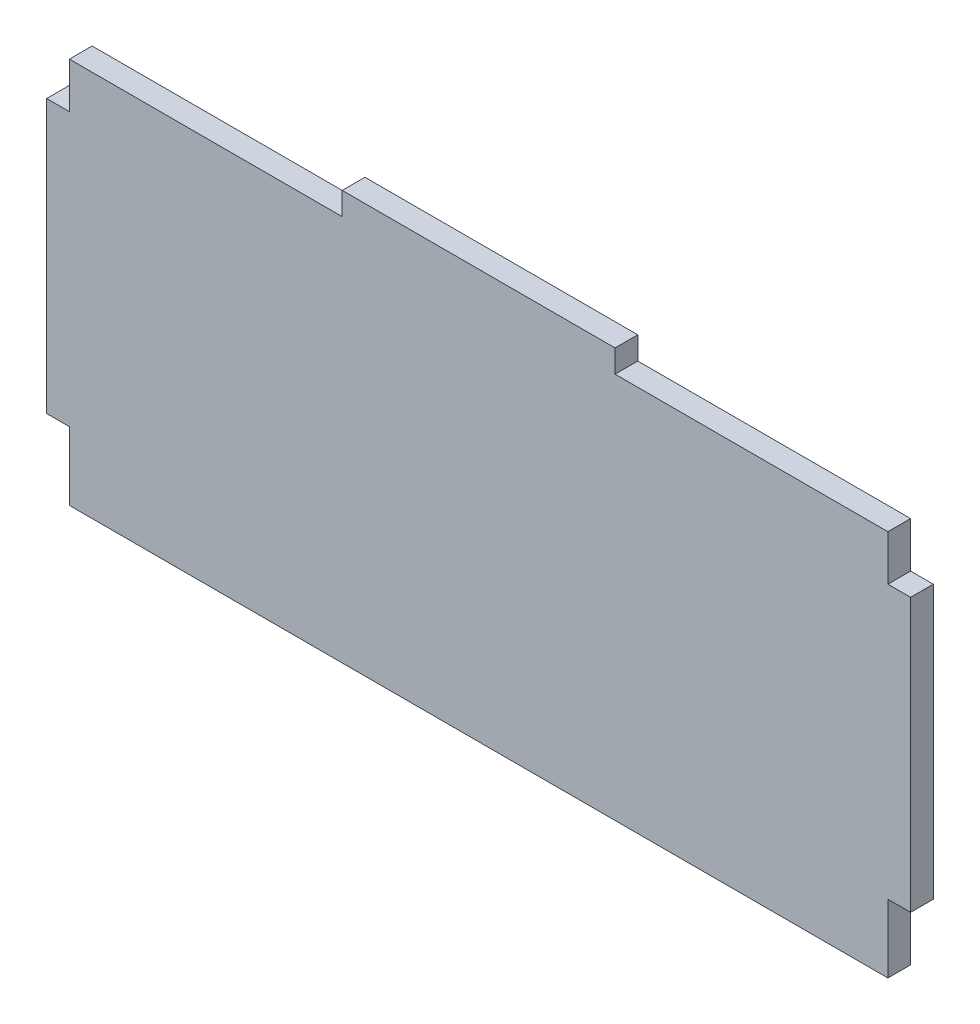
ISO-10303-21;
HEADER;
FILE_DESCRIPTION(('STEP AP214'),'2;1');
FILE_NAME('part.step','',(''),(''),'','','');
FILE_SCHEMA(('AUTOMOTIVE_DESIGN { 1 0 10303 214 1 1 1 1 }'));
ENDSEC;
DATA;
#1=APPLICATION_CONTEXT('core data for automotive mechanical design processes');
#2=APPLICATION_PROTOCOL_DEFINITION('international standard','automotive_design',2000,#1);
#3=PRODUCT_CONTEXT('',#1,'mechanical');
#4=PRODUCT('Part','Part','',(#3));
#5=PRODUCT_RELATED_PRODUCT_CATEGORY('part','',(#4));
#6=PRODUCT_DEFINITION_FORMATION('','',#4);
#7=PRODUCT_DEFINITION_CONTEXT('part definition',#1,'design');
#8=PRODUCT_DEFINITION('design','',#6,#7);
#9=PRODUCT_DEFINITION_SHAPE('','',#8);
#10=(LENGTH_UNIT() NAMED_UNIT(*) SI_UNIT(.MILLI.,.METRE.));
#11=(NAMED_UNIT(*) PLANE_ANGLE_UNIT() SI_UNIT($,.RADIAN.));
#12=(NAMED_UNIT(*) SI_UNIT($,.STERADIAN.) SOLID_ANGLE_UNIT());
#13=UNCERTAINTY_MEASURE_WITH_UNIT(LENGTH_MEASURE(1.E-05),#10,'distance_accuracy_value','');
#14=(GEOMETRIC_REPRESENTATION_CONTEXT(3) GLOBAL_UNCERTAINTY_ASSIGNED_CONTEXT((#13)) GLOBAL_UNIT_ASSIGNED_CONTEXT((#10,
#11,#12)) REPRESENTATION_CONTEXT('',''));
#15=CARTESIAN_POINT('',(0.,0.,0.));
#16=DIRECTION('',(0.,0.,1.));
#17=DIRECTION('',(1.,0.,0.));
#18=AXIS2_PLACEMENT_3D('',#15,#16,#17);
#19=CARTESIAN_POINT('',(179.033678216416,0.,6.35));
#20=DIRECTION('',(1.,0.,0.));
#21=DIRECTION('',(0.,1.,0.));
#22=AXIS2_PLACEMENT_3D('',#19,#20,#21);
#23=PLANE('',#22);
#24=DIRECTION('',(0.,-1.,0.));
#25=VECTOR('',#24,1.);
#26=CARTESIAN_POINT('',(179.033678216416,0.,0.));
#27=LINE('',#26,#25);
#28=CARTESIAN_POINT('',(179.033678216416,19.051893638171,0.));
#29=VERTEX_POINT('',#28);
#30=CARTESIAN_POINT('',(179.033678216416,6.35189363817097,0.));
#31=VERTEX_POINT('',#30);
#32=EDGE_CURVE('E176',#29,#31,#27,.T.);
#33=ORIENTED_EDGE('',*,*,#32,.F.);
#34=DIRECTION('',(0.,0.,-1.));
#35=VECTOR('',#34,1.);
#36=CARTESIAN_POINT('',(179.033678216416,19.051893638171,6.35));
#37=LINE('',#36,#35);
#38=CARTESIAN_POINT('',(179.033678216416,19.051893638171,6.35));
#39=VERTEX_POINT('',#38);
#40=EDGE_CURVE('E11',#39,#29,#37,.T.);
#41=ORIENTED_EDGE('',*,*,#40,.F.);
#42=DIRECTION('',(0.,-1.,0.));
#43=VECTOR('',#42,1.);
#44=CARTESIAN_POINT('',(179.033678216416,0.,6.35));
#45=LINE('',#44,#43);
#46=CARTESIAN_POINT('',(179.033678216416,6.35189363817097,6.35));
#47=VERTEX_POINT('',#46);
#48=EDGE_CURVE('E212',#39,#47,#45,.T.);
#49=ORIENTED_EDGE('',*,*,#48,.T.);
#50=DIRECTION('',(0.,0.,-1.));
#51=VECTOR('',#50,1.);
#52=CARTESIAN_POINT('',(179.033678216416,6.35189363817097,6.35));
#53=LINE('',#52,#51);
#54=EDGE_CURVE('E52',#47,#31,#53,.T.);
#55=ORIENTED_EDGE('',*,*,#54,.T.);
#56=EDGE_LOOP('',(#33,#41,#49,#55));
#57=FACE_BOUND('',#56,.T.);
#58=ADVANCED_FACE('F35',(#57),#23,.T.);
#59=CARTESIAN_POINT('',(0.,19.051893638171,6.35));
#60=DIRECTION('',(0.,1.,0.));
#61=DIRECTION('',(0.,0.,1.));
#62=AXIS2_PLACEMENT_3D('',#59,#60,#61);
#63=PLANE('',#62);
#64=DIRECTION('',(1.,0.,0.));
#65=VECTOR('',#64,1.);
#66=CARTESIAN_POINT('',(0.,19.051893638171,0.));
#67=LINE('',#66,#65);
#68=CARTESIAN_POINT('',(102.833678216416,19.051893638171,0.));
#69=VERTEX_POINT('',#68);
#70=EDGE_CURVE('E178',#69,#29,#67,.T.);
#71=ORIENTED_EDGE('',*,*,#70,.F.);
#72=DIRECTION('',(0.,0.,-1.));
#73=VECTOR('',#72,1.);
#74=CARTESIAN_POINT('',(102.833678216416,19.051893638171,6.35));
#75=LINE('',#74,#73);
#76=CARTESIAN_POINT('',(102.833678216416,19.051893638171,6.35));
#77=VERTEX_POINT('',#76);
#78=EDGE_CURVE('E44',#77,#69,#75,.T.);
#79=ORIENTED_EDGE('',*,*,#78,.F.);
#80=DIRECTION('',(1.,0.,0.));
#81=VECTOR('',#80,1.);
#82=CARTESIAN_POINT('',(0.,19.051893638171,6.35));
#83=LINE('',#82,#81);
#84=EDGE_CURVE('E259',#77,#39,#83,.T.);
#85=ORIENTED_EDGE('',*,*,#84,.T.);
#86=ORIENTED_EDGE('',*,*,#40,.T.);
#87=EDGE_LOOP('',(#71,#79,#85,#86));
#88=FACE_BOUND('',#87,.T.);
#89=ADVANCED_FACE('F247',(#88),#63,.T.);
#90=CARTESIAN_POINT('',(102.833678216416,0.,6.35));
#91=DIRECTION('',(1.,0.,0.));
#92=DIRECTION('',(0.,0.,-1.));
#93=AXIS2_PLACEMENT_3D('',#90,#91,#92);
#94=PLANE('',#93);
#95=DIRECTION('',(0.,-1.,0.));
#96=VECTOR('',#95,1.);
#97=CARTESIAN_POINT('',(102.833678216416,0.,0.));
#98=LINE('',#97,#96);
#99=CARTESIAN_POINT('',(102.833678216416,25.401893638171,0.));
#100=VERTEX_POINT('',#99);
#101=EDGE_CURVE('E182',#100,#69,#98,.T.);
#102=ORIENTED_EDGE('',*,*,#101,.F.);
#103=DIRECTION('',(0.,0.,-1.));
#104=VECTOR('',#103,1.);
#105=CARTESIAN_POINT('',(102.833678216416,25.401893638171,6.35));
#106=LINE('',#105,#104);
#107=CARTESIAN_POINT('',(102.833678216416,25.401893638171,6.35));
#108=VERTEX_POINT('',#107);
#109=EDGE_CURVE('E237',#108,#100,#106,.T.);
#110=ORIENTED_EDGE('',*,*,#109,.F.);
#111=DIRECTION('',(0.,-1.,0.));
#112=VECTOR('',#111,1.);
#113=CARTESIAN_POINT('',(102.833678216416,0.,6.35));
#114=LINE('',#113,#112);
#115=EDGE_CURVE('E243',#108,#77,#114,.T.);
#116=ORIENTED_EDGE('',*,*,#115,.T.);
#117=ORIENTED_EDGE('',*,*,#78,.T.);
#118=EDGE_LOOP('',(#102,#110,#116,#117));
#119=FACE_BOUND('',#118,.T.);
#120=ADVANCED_FACE('F37',(#119),#94,.T.);
#121=CARTESIAN_POINT('',(0.,25.401893638171,6.35));
#122=DIRECTION('',(0.,1.,0.));
#123=DIRECTION('',(0.,0.,1.));
#124=AXIS2_PLACEMENT_3D('',#121,#122,#123);
#125=PLANE('',#124);
#126=DIRECTION('',(1.,0.,0.));
#127=VECTOR('',#126,1.);
#128=CARTESIAN_POINT('',(0.,25.401893638171,0.));
#129=LINE('',#128,#127);
#130=CARTESIAN_POINT('',(26.6336782164157,25.401893638171,0.));
#131=VERTEX_POINT('',#130);
#132=EDGE_CURVE('E186',#131,#100,#129,.T.);
#133=ORIENTED_EDGE('',*,*,#132,.F.);
#134=DIRECTION('',(0.,0.,-1.));
#135=VECTOR('',#134,1.);
#136=CARTESIAN_POINT('',(26.6336782164157,25.401893638171,6.35));
#137=LINE('',#136,#135);
#138=CARTESIAN_POINT('',(26.6336782164157,25.401893638171,6.35));
#139=VERTEX_POINT('',#138);
#140=EDGE_CURVE('E235',#139,#131,#137,.T.);
#141=ORIENTED_EDGE('',*,*,#140,.F.);
#142=DIRECTION('',(1.,0.,0.));
#143=VECTOR('',#142,1.);
#144=CARTESIAN_POINT('',(0.,25.401893638171,6.35));
#145=LINE('',#144,#143);
#146=EDGE_CURVE('E258',#139,#108,#145,.T.);
#147=ORIENTED_EDGE('',*,*,#146,.T.);
#148=ORIENTED_EDGE('',*,*,#109,.T.);
#149=EDGE_LOOP('',(#133,#141,#147,#148));
#150=FACE_BOUND('',#149,.T.);
#151=ADVANCED_FACE('F254',(#150),#125,.T.);
#152=CARTESIAN_POINT('',(26.6336782164158,0.,6.35));
#153=DIRECTION('',(1.,0.,0.));
#154=DIRECTION('',(0.,1.,0.));
#155=AXIS2_PLACEMENT_3D('',#152,#153,#154);
#156=PLANE('',#155);
#157=DIRECTION('',(0.,-1.,0.));
#158=VECTOR('',#157,1.);
#159=CARTESIAN_POINT('',(26.6336782164158,0.,0.));
#160=LINE('',#159,#158);
#161=CARTESIAN_POINT('',(26.6336782164157,19.051893638171,0.));
#162=VERTEX_POINT('',#161);
#163=EDGE_CURVE('E189',#131,#162,#160,.T.);
#164=ORIENTED_EDGE('',*,*,#163,.T.);
#165=DIRECTION('',(0.,0.,-1.));
#166=VECTOR('',#165,1.);
#167=CARTESIAN_POINT('',(26.6336782164157,19.051893638171,6.35));
#168=LINE('',#167,#166);
#169=CARTESIAN_POINT('',(26.6336782164157,19.051893638171,6.35));
#170=VERTEX_POINT('',#169);
#171=EDGE_CURVE('E233',#170,#162,#168,.T.);
#172=ORIENTED_EDGE('',*,*,#171,.F.);
#173=DIRECTION('',(0.,-1.,0.));
#174=VECTOR('',#173,1.);
#175=CARTESIAN_POINT('',(26.6336782164158,0.,6.35));
#176=LINE('',#175,#174);
#177=EDGE_CURVE('E261',#139,#170,#176,.T.);
#178=ORIENTED_EDGE('',*,*,#177,.F.);
#179=ORIENTED_EDGE('',*,*,#140,.T.);
#180=EDGE_LOOP('',(#164,#172,#178,#179));
#181=FACE_BOUND('',#180,.T.);
#182=ADVANCED_FACE('F337',(#181),#156,.F.);
#183=CARTESIAN_POINT('',(-49.5663217835843,19.051893638171,0.));
#184=VERTEX_POINT('',#183);
#185=EDGE_CURVE('E183',#184,#162,#67,.T.);
#186=ORIENTED_EDGE('',*,*,#185,.F.);
#187=DIRECTION('',(0.,0.,-1.));
#188=VECTOR('',#187,1.);
#189=CARTESIAN_POINT('',(-49.5663217835843,19.051893638171,6.35));
#190=LINE('',#189,#188);
#191=CARTESIAN_POINT('',(-49.5663217835843,19.051893638171,6.35));
#192=VERTEX_POINT('',#191);
#193=EDGE_CURVE('E231',#192,#184,#190,.T.);
#194=ORIENTED_EDGE('',*,*,#193,.F.);
#195=EDGE_CURVE('E264',#192,#170,#83,.T.);
#196=ORIENTED_EDGE('',*,*,#195,.T.);
#197=ORIENTED_EDGE('',*,*,#171,.T.);
#198=EDGE_LOOP('',(#186,#194,#196,#197));
#199=FACE_BOUND('',#198,.T.);
#200=ADVANCED_FACE('F310',(#199),#63,.T.);
#201=CARTESIAN_POINT('',(-49.5663217835842,0.,6.35));
#202=DIRECTION('',(1.,0.,0.));
#203=DIRECTION('',(0.,1.,0.));
#204=AXIS2_PLACEMENT_3D('',#201,#202,#203);
#205=PLANE('',#204);
#206=DIRECTION('',(0.,-1.,0.));
#207=VECTOR('',#206,1.);
#208=CARTESIAN_POINT('',(-49.5663217835842,0.,0.));
#209=LINE('',#208,#207);
#210=CARTESIAN_POINT('',(-49.5663217835842,6.35189363817098,0.));
#211=VERTEX_POINT('',#210);
#212=EDGE_CURVE('E192',#184,#211,#209,.T.);
#213=ORIENTED_EDGE('',*,*,#212,.T.);
#214=DIRECTION('',(0.,0.,-1.));
#215=VECTOR('',#214,1.);
#216=CARTESIAN_POINT('',(-49.5663217835842,6.35189363817098,6.35));
#217=LINE('',#216,#215);
#218=CARTESIAN_POINT('',(-49.5663217835842,6.35189363817098,6.35));
#219=VERTEX_POINT('',#218);
#220=EDGE_CURVE('E229',#219,#211,#217,.T.);
#221=ORIENTED_EDGE('',*,*,#220,.F.);
#222=DIRECTION('',(0.,-1.,0.));
#223=VECTOR('',#222,1.);
#224=CARTESIAN_POINT('',(-49.5663217835842,0.,6.35));
#225=LINE('',#224,#223);
#226=EDGE_CURVE('E268',#192,#219,#225,.T.);
#227=ORIENTED_EDGE('',*,*,#226,.F.);
#228=ORIENTED_EDGE('',*,*,#193,.T.);
#229=EDGE_LOOP('',(#213,#221,#227,#228));
#230=FACE_BOUND('',#229,.T.);
#231=ADVANCED_FACE('F323',(#230),#205,.F.);
#232=CARTESIAN_POINT('',(0.,6.35189363817097,6.35));
#233=DIRECTION('',(0.,1.,0.));
#234=DIRECTION('',(-1.,0.,0.));
#235=AXIS2_PLACEMENT_3D('',#232,#233,#234);
#236=PLANE('',#235);
#237=DIRECTION('',(1.,0.,0.));
#238=VECTOR('',#237,1.);
#239=CARTESIAN_POINT('',(0.,6.35189363817097,0.));
#240=LINE('',#239,#238);
#241=CARTESIAN_POINT('',(-55.9163217835843,6.35189363817098,0.));
#242=VERTEX_POINT('',#241);
#243=EDGE_CURVE('E195',#242,#211,#240,.T.);
#244=ORIENTED_EDGE('',*,*,#243,.F.);
#245=DIRECTION('',(0.,0.,-1.));
#246=VECTOR('',#245,1.);
#247=CARTESIAN_POINT('',(-55.9163217835843,6.35189363817098,6.35));
#248=LINE('',#247,#246);
#249=CARTESIAN_POINT('',(-55.9163217835843,6.35189363817098,6.35));
#250=VERTEX_POINT('',#249);
#251=EDGE_CURVE('E227',#250,#242,#248,.T.);
#252=ORIENTED_EDGE('',*,*,#251,.F.);
#253=DIRECTION('',(1.,0.,0.));
#254=VECTOR('',#253,1.);
#255=CARTESIAN_POINT('',(0.,6.35189363817097,6.35));
#256=LINE('',#255,#254);
#257=EDGE_CURVE('E270',#250,#219,#256,.T.);
#258=ORIENTED_EDGE('',*,*,#257,.T.);
#259=ORIENTED_EDGE('',*,*,#220,.T.);
#260=EDGE_LOOP('',(#244,#252,#258,#259));
#261=FACE_BOUND('',#260,.T.);
#262=ADVANCED_FACE('F331',(#261),#236,.T.);
#263=CARTESIAN_POINT('',(-55.9163217835843,0.,6.35));
#264=DIRECTION('',(1.,0.,0.));
#265=DIRECTION('',(0.,1.,0.));
#266=AXIS2_PLACEMENT_3D('',#263,#264,#265);
#267=PLANE('',#266);
#268=DIRECTION('',(0.,-1.,0.));
#269=VECTOR('',#268,1.);
#270=CARTESIAN_POINT('',(-55.9163217835843,0.,0.));
#271=LINE('',#270,#269);
#272=CARTESIAN_POINT('',(-55.9163217835842,-69.848106361829,0.));
#273=VERTEX_POINT('',#272);
#274=EDGE_CURVE('E199',#242,#273,#271,.T.);
#275=ORIENTED_EDGE('',*,*,#274,.T.);
#276=DIRECTION('',(0.,0.,-1.));
#277=VECTOR('',#276,1.);
#278=CARTESIAN_POINT('',(-55.9163217835842,-69.848106361829,6.35));
#279=LINE('',#278,#277);
#280=CARTESIAN_POINT('',(-55.9163217835842,-69.848106361829,6.35));
#281=VERTEX_POINT('',#280);
#282=EDGE_CURVE('E224',#281,#273,#279,.T.);
#283=ORIENTED_EDGE('',*,*,#282,.F.);
#284=DIRECTION('',(0.,-1.,0.));
#285=VECTOR('',#284,1.);
#286=CARTESIAN_POINT('',(-55.9163217835843,0.,6.35));
#287=LINE('',#286,#285);
#288=EDGE_CURVE('E274',#250,#281,#287,.T.);
#289=ORIENTED_EDGE('',*,*,#288,.F.);
#290=ORIENTED_EDGE('',*,*,#251,.T.);
#291=EDGE_LOOP('',(#275,#283,#289,#290));
#292=FACE_BOUND('',#291,.T.);
#293=ADVANCED_FACE('F327',(#292),#267,.F.);
#294=CARTESIAN_POINT('',(0.,-69.848106361829,6.35));
#295=DIRECTION('',(0.,1.,0.));
#296=DIRECTION('',(0.,0.,1.));
#297=AXIS2_PLACEMENT_3D('',#294,#295,#296);
#298=PLANE('',#297);
#299=DIRECTION('',(1.,0.,0.));
#300=VECTOR('',#299,1.);
#301=CARTESIAN_POINT('',(0.,-69.848106361829,0.));
#302=LINE('',#301,#300);
#303=CARTESIAN_POINT('',(-49.5663217835842,-69.848106361829,0.));
#304=VERTEX_POINT('',#303);
#305=EDGE_CURVE('E201',#273,#304,#302,.T.);
#306=ORIENTED_EDGE('',*,*,#305,.T.);
#307=DIRECTION('',(0.,0.,-1.));
#308=VECTOR('',#307,1.);
#309=CARTESIAN_POINT('',(-49.5663217835842,-69.848106361829,6.35));
#310=LINE('',#309,#308);
#311=CARTESIAN_POINT('',(-49.5663217835842,-69.848106361829,6.35));
#312=VERTEX_POINT('',#311);
#313=EDGE_CURVE('E221',#312,#304,#310,.T.);
#314=ORIENTED_EDGE('',*,*,#313,.F.);
#315=DIRECTION('',(1.,0.,0.));
#316=VECTOR('',#315,1.);
#317=CARTESIAN_POINT('',(0.,-69.848106361829,6.35));
#318=LINE('',#317,#316);
#319=EDGE_CURVE('E276',#281,#312,#318,.T.);
#320=ORIENTED_EDGE('',*,*,#319,.F.);
#321=ORIENTED_EDGE('',*,*,#282,.T.);
#322=EDGE_LOOP('',(#306,#314,#320,#321));
#323=FACE_BOUND('',#322,.T.);
#324=ADVANCED_FACE('F321',(#323),#298,.F.);
#325=CARTESIAN_POINT('',(-49.5663217835842,-88.898106361829,0.));
#326=VERTEX_POINT('',#325);
#327=EDGE_CURVE('E196',#304,#326,#209,.T.);
#328=ORIENTED_EDGE('',*,*,#327,.T.);
#329=DIRECTION('',(0.,0.,-1.));
#330=VECTOR('',#329,1.);
#331=CARTESIAN_POINT('',(-49.5663217835842,-88.898106361829,6.35));
#332=LINE('',#331,#330);
#333=CARTESIAN_POINT('',(-49.5663217835842,-88.898106361829,6.35));
#334=VERTEX_POINT('',#333);
#335=EDGE_CURVE('E218',#334,#326,#332,.T.);
#336=ORIENTED_EDGE('',*,*,#335,.F.);
#337=EDGE_CURVE('E271',#312,#334,#225,.T.);
#338=ORIENTED_EDGE('',*,*,#337,.F.);
#339=ORIENTED_EDGE('',*,*,#313,.T.);
#340=EDGE_LOOP('',(#328,#336,#338,#339));
#341=FACE_BOUND('',#340,.T.);
#342=ADVANCED_FACE('F285',(#341),#205,.F.);
#343=CARTESIAN_POINT('',(0.,-88.898106361829,6.35));
#344=DIRECTION('',(0.,1.,0.));
#345=DIRECTION('',(0.,0.,1.));
#346=AXIS2_PLACEMENT_3D('',#343,#344,#345);
#347=PLANE('',#346);
#348=DIRECTION('',(1.,0.,0.));
#349=VECTOR('',#348,1.);
#350=CARTESIAN_POINT('',(0.,-88.898106361829,0.));
#351=LINE('',#350,#349);
#352=CARTESIAN_POINT('',(179.033678216416,-88.898106361829,0.));
#353=VERTEX_POINT('',#352);
#354=EDGE_CURVE('E203',#326,#353,#351,.T.);
#355=ORIENTED_EDGE('',*,*,#354,.T.);
#356=DIRECTION('',(0.,0.,-1.));
#357=VECTOR('',#356,1.);
#358=CARTESIAN_POINT('',(179.033678216416,-88.898106361829,6.35));
#359=LINE('',#358,#357);
#360=CARTESIAN_POINT('',(179.033678216416,-88.898106361829,6.35));
#361=VERTEX_POINT('',#360);
#362=EDGE_CURVE('E216',#361,#353,#359,.T.);
#363=ORIENTED_EDGE('',*,*,#362,.F.);
#364=DIRECTION('',(1.,0.,0.));
#365=VECTOR('',#364,1.);
#366=CARTESIAN_POINT('',(0.,-88.898106361829,6.35));
#367=LINE('',#366,#365);
#368=EDGE_CURVE('E277',#334,#361,#367,.T.);
#369=ORIENTED_EDGE('',*,*,#368,.F.);
#370=ORIENTED_EDGE('',*,*,#335,.T.);
#371=EDGE_LOOP('',(#355,#363,#369,#370));
#372=FACE_BOUND('',#371,.T.);
#373=ADVANCED_FACE('F289',(#372),#347,.F.);
#374=CARTESIAN_POINT('',(179.033678216416,-69.848106361829,0.));
#375=VERTEX_POINT('',#374);
#376=EDGE_CURVE('E179',#375,#353,#27,.T.);
#377=ORIENTED_EDGE('',*,*,#376,.F.);
#378=DIRECTION('',(0.,0.,-1.));
#379=VECTOR('',#378,1.);
#380=CARTESIAN_POINT('',(179.033678216416,-69.848106361829,6.35));
#381=LINE('',#380,#379);
#382=CARTESIAN_POINT('',(179.033678216416,-69.848106361829,6.35));
#383=VERTEX_POINT('',#382);
#384=EDGE_CURVE('E168',#383,#375,#381,.T.);
#385=ORIENTED_EDGE('',*,*,#384,.F.);
#386=EDGE_CURVE('E158',#383,#361,#45,.T.);
#387=ORIENTED_EDGE('',*,*,#386,.T.);
#388=ORIENTED_EDGE('',*,*,#362,.T.);
#389=EDGE_LOOP('',(#377,#385,#387,#388));
#390=FACE_BOUND('',#389,.T.);
#391=ADVANCED_FACE('F293',(#390),#23,.T.);
#392=CARTESIAN_POINT('',(0.,-69.848106361829,6.35));
#393=DIRECTION('',(0.,1.,0.));
#394=DIRECTION('',(0.,0.,1.));
#395=AXIS2_PLACEMENT_3D('',#392,#393,#394);
#396=PLANE('',#395);
#397=DIRECTION('',(1.,0.,0.));
#398=VECTOR('',#397,1.);
#399=CARTESIAN_POINT('',(0.,-69.848106361829,0.));
#400=LINE('',#399,#398);
#401=CARTESIAN_POINT('',(185.383678216416,-69.848106361829,0.));
#402=VERTEX_POINT('',#401);
#403=EDGE_CURVE('E165',#375,#402,#400,.T.);
#404=ORIENTED_EDGE('',*,*,#403,.T.);
#405=DIRECTION('',(0.,0.,-1.));
#406=VECTOR('',#405,1.);
#407=CARTESIAN_POINT('',(185.383678216416,-69.848106361829,6.35));
#408=LINE('',#407,#406);
#409=CARTESIAN_POINT('',(185.383678216416,-69.848106361829,6.35));
#410=VERTEX_POINT('',#409);
#411=EDGE_CURVE('E162',#410,#402,#408,.T.);
#412=ORIENTED_EDGE('',*,*,#411,.F.);
#413=DIRECTION('',(1.,0.,0.));
#414=VECTOR('',#413,1.);
#415=CARTESIAN_POINT('',(0.,-69.848106361829,6.35));
#416=LINE('',#415,#414);
#417=EDGE_CURVE('E151',#383,#410,#416,.T.);
#418=ORIENTED_EDGE('',*,*,#417,.F.);
#419=ORIENTED_EDGE('',*,*,#384,.T.);
#420=EDGE_LOOP('',(#404,#412,#418,#419));
#421=FACE_BOUND('',#420,.T.);
#422=ADVANCED_FACE('F163',(#421),#396,.F.);
#423=CARTESIAN_POINT('',(185.383678216416,0.,6.35));
#424=DIRECTION('',(1.,0.,0.));
#425=DIRECTION('',(0.,1.,0.));
#426=AXIS2_PLACEMENT_3D('',#423,#424,#425);
#427=PLANE('',#426);
#428=DIRECTION('',(0.,-1.,0.));
#429=VECTOR('',#428,1.);
#430=CARTESIAN_POINT('',(185.383678216416,0.,0.));
#431=LINE('',#430,#429);
#432=CARTESIAN_POINT('',(185.383678216416,6.35189363817097,0.));
#433=VERTEX_POINT('',#432);
#434=EDGE_CURVE('E207',#433,#402,#431,.T.);
#435=ORIENTED_EDGE('',*,*,#434,.F.);
#436=DIRECTION('',(0.,0.,-1.));
#437=VECTOR('',#436,1.);
#438=CARTESIAN_POINT('',(185.383678216416,6.35189363817097,6.35));
#439=LINE('',#438,#437);
#440=CARTESIAN_POINT('',(185.383678216416,6.35189363817097,6.35));
#441=VERTEX_POINT('',#440);
#442=EDGE_CURVE('E101',#441,#433,#439,.T.);
#443=ORIENTED_EDGE('',*,*,#442,.F.);
#444=DIRECTION('',(0.,-1.,0.));
#445=VECTOR('',#444,1.);
#446=CARTESIAN_POINT('',(185.383678216416,0.,6.35));
#447=LINE('',#446,#445);
#448=EDGE_CURVE('E156',#441,#410,#447,.T.);
#449=ORIENTED_EDGE('',*,*,#448,.T.);
#450=ORIENTED_EDGE('',*,*,#411,.T.);
#451=EDGE_LOOP('',(#435,#443,#449,#450));
#452=FACE_BOUND('',#451,.T.);
#453=ADVANCED_FACE('F170',(#452),#427,.T.);
#454=CARTESIAN_POINT('',(0.,6.35189363817102,6.35));
#455=DIRECTION('',(0.,1.,0.));
#456=DIRECTION('',(-1.,0.,0.));
#457=AXIS2_PLACEMENT_3D('',#454,#455,#456);
#458=PLANE('',#457);
#459=DIRECTION('',(1.,0.,0.));
#460=VECTOR('',#459,1.);
#461=CARTESIAN_POINT('',(0.,6.35189363817102,0.));
#462=LINE('',#461,#460);
#463=EDGE_CURVE('E209',#31,#433,#462,.T.);
#464=ORIENTED_EDGE('',*,*,#463,.F.);
#465=ORIENTED_EDGE('',*,*,#54,.F.);
#466=DIRECTION('',(1.,0.,0.));
#467=VECTOR('',#466,1.);
#468=CARTESIAN_POINT('',(0.,6.35189363817102,6.35));
#469=LINE('',#468,#467);
#470=EDGE_CURVE('E171',#47,#441,#469,.T.);
#471=ORIENTED_EDGE('',*,*,#470,.T.);
#472=ORIENTED_EDGE('',*,*,#442,.T.);
#473=EDGE_LOOP('',(#464,#465,#471,#472));
#474=FACE_BOUND('',#473,.T.);
#475=ADVANCED_FACE('F294',(#474),#458,.T.);
#476=CARTESIAN_POINT('',(0.,0.,6.35));
#477=DIRECTION('',(0.,0.,1.));
#478=DIRECTION('',(1.,0.,0.));
#479=AXIS2_PLACEMENT_3D('',#476,#477,#478);
#480=PLANE('',#479);
#481=ORIENTED_EDGE('',*,*,#48,.F.);
#482=ORIENTED_EDGE('',*,*,#84,.F.);
#483=ORIENTED_EDGE('',*,*,#115,.F.);
#484=ORIENTED_EDGE('',*,*,#146,.F.);
#485=ORIENTED_EDGE('',*,*,#177,.T.);
#486=ORIENTED_EDGE('',*,*,#195,.F.);
#487=ORIENTED_EDGE('',*,*,#226,.T.);
#488=ORIENTED_EDGE('',*,*,#257,.F.);
#489=ORIENTED_EDGE('',*,*,#288,.T.);
#490=ORIENTED_EDGE('',*,*,#319,.T.);
#491=ORIENTED_EDGE('',*,*,#337,.T.);
#492=ORIENTED_EDGE('',*,*,#368,.T.);
#493=ORIENTED_EDGE('',*,*,#386,.F.);
#494=ORIENTED_EDGE('',*,*,#417,.T.);
#495=ORIENTED_EDGE('',*,*,#448,.F.);
#496=ORIENTED_EDGE('',*,*,#470,.F.);
#497=EDGE_LOOP('',(#481,#482,#483,#484,#485,#486,#487,#488,#489,#490,#491,#492,#493,#494,#495,#496));
#498=FACE_BOUND('',#497,.T.);
#499=ADVANCED_FACE('F153',(#498),#480,.T.);
#500=CARTESIAN_POINT('',(0.,0.,0.));
#501=DIRECTION('',(0.,0.,1.));
#502=DIRECTION('',(1.,0.,0.));
#503=AXIS2_PLACEMENT_3D('',#500,#501,#502);
#504=PLANE('',#503);
#505=ORIENTED_EDGE('',*,*,#32,.T.);
#506=ORIENTED_EDGE('',*,*,#463,.T.);
#507=ORIENTED_EDGE('',*,*,#434,.T.);
#508=ORIENTED_EDGE('',*,*,#403,.F.);
#509=ORIENTED_EDGE('',*,*,#376,.T.);
#510=ORIENTED_EDGE('',*,*,#354,.F.);
#511=ORIENTED_EDGE('',*,*,#327,.F.);
#512=ORIENTED_EDGE('',*,*,#305,.F.);
#513=ORIENTED_EDGE('',*,*,#274,.F.);
#514=ORIENTED_EDGE('',*,*,#243,.T.);
#515=ORIENTED_EDGE('',*,*,#212,.F.);
#516=ORIENTED_EDGE('',*,*,#185,.T.);
#517=ORIENTED_EDGE('',*,*,#163,.F.);
#518=ORIENTED_EDGE('',*,*,#132,.T.);
#519=ORIENTED_EDGE('',*,*,#101,.T.);
#520=ORIENTED_EDGE('',*,*,#70,.T.);
#521=EDGE_LOOP('',(#505,#506,#507,#508,#509,#510,#511,#512,#513,#514,#515,#516,#517,#518,#519,#520));
#522=FACE_BOUND('',#521,.T.);
#523=ADVANCED_FACE('F249',(#522),#504,.F.);
#524=CLOSED_SHELL('',(#58,#89,#120,#151,#182,#200,#231,#262,#293,#324,#342,#373,#391,#422,#453,
#475,#499,#523));
#525=MANIFOLD_SOLID_BREP('B2',#524);
#526=ADVANCED_BREP_SHAPE_REPRESENTATION('',(#18,#525),#14);
#527=SHAPE_DEFINITION_REPRESENTATION(#9,#526);
ENDSEC;
END-ISO-10303-21;
